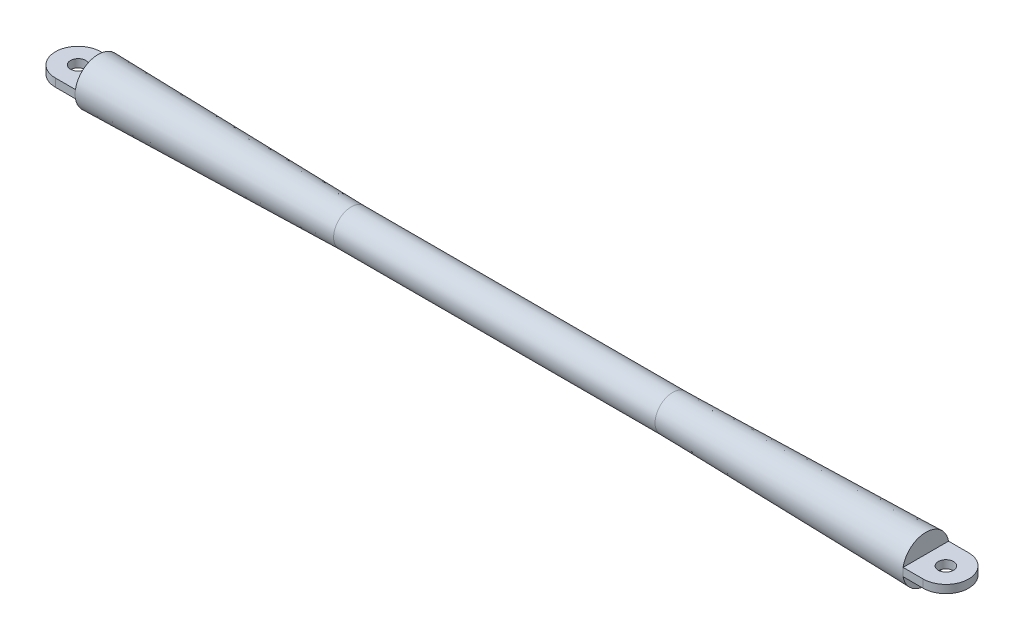
ISO-10303-21;
HEADER;
FILE_DESCRIPTION(('STEP AP214'),'2;1');
FILE_NAME('part.step','',(''),(''),'','','');
FILE_SCHEMA(('AUTOMOTIVE_DESIGN { 1 0 10303 214 1 1 1 1 }'));
ENDSEC;
DATA;
#1=APPLICATION_CONTEXT('core data for automotive mechanical design processes');
#2=APPLICATION_PROTOCOL_DEFINITION('international standard','automotive_design',2000,#1);
#3=PRODUCT_CONTEXT('',#1,'mechanical');
#4=PRODUCT('Part','Part','',(#3));
#5=PRODUCT_RELATED_PRODUCT_CATEGORY('part','',(#4));
#6=PRODUCT_DEFINITION_FORMATION('','',#4);
#7=PRODUCT_DEFINITION_CONTEXT('part definition',#1,'design');
#8=PRODUCT_DEFINITION('design','',#6,#7);
#9=PRODUCT_DEFINITION_SHAPE('','',#8);
#10=(LENGTH_UNIT() NAMED_UNIT(*) SI_UNIT(.MILLI.,.METRE.));
#11=(NAMED_UNIT(*) PLANE_ANGLE_UNIT() SI_UNIT($,.RADIAN.));
#12=(NAMED_UNIT(*) SI_UNIT($,.STERADIAN.) SOLID_ANGLE_UNIT());
#13=UNCERTAINTY_MEASURE_WITH_UNIT(LENGTH_MEASURE(1.E-05),#10,'distance_accuracy_value','');
#14=(GEOMETRIC_REPRESENTATION_CONTEXT(3) GLOBAL_UNCERTAINTY_ASSIGNED_CONTEXT((#13)) GLOBAL_UNIT_ASSIGNED_CONTEXT((#10,
#11,#12)) REPRESENTATION_CONTEXT('',''));
#15=CARTESIAN_POINT('',(0.,0.,0.));
#16=DIRECTION('',(0.,0.,1.));
#17=DIRECTION('',(1.,0.,0.));
#18=AXIS2_PLACEMENT_3D('',#15,#16,#17);
#19=CARTESIAN_POINT('',(575.,0.,0.));
#20=DIRECTION('',(1.,0.,0.));
#21=DIRECTION('',(0.,0.,-1.));
#22=AXIS2_PLACEMENT_3D('',#19,#20,#21);
#23=CONICAL_SURFACE('',#22,30.,0.0213300978711052);
#24=CARTESIAN_POINT('',(200.,0.,0.));
#25=DIRECTION('',(-1.,0.,0.));
#26=DIRECTION('',(0.,0.,1.));
#27=AXIS2_PLACEMENT_3D('',#24,#25,#26);
#28=CIRCLE('',#27,22.);
#29=CARTESIAN_POINT('',(200.,0.,22.));
#30=VERTEX_POINT('',#29);
#31=EDGE_CURVE('E189',#30,#30,#28,.T.);
#32=ORIENTED_EDGE('',*,*,#31,.F.);
#33=EDGE_LOOP('',(#32));
#34=FACE_BOUND('',#33,.T.);
#35=CARTESIAN_POINT('',(515.,0.,0.));
#36=DIRECTION('',(-1.,0.,0.));
#37=DIRECTION('',(0.,0.,1.));
#38=AXIS2_PLACEMENT_3D('',#35,#36,#37);
#39=CIRCLE('',#38,28.72);
#40=CARTESIAN_POINT('',(515.,5.,28.2814143917874));
#41=VERTEX_POINT('',#40);
#42=CARTESIAN_POINT('',(515.,5.,-28.2814143917874));
#43=VERTEX_POINT('',#42);
#44=EDGE_CURVE('E197',#41,#43,#39,.T.);
#45=ORIENTED_EDGE('',*,*,#44,.T.);
#46=CARTESIAN_POINT('',(515.,0.,0.));
#47=DIRECTION('',(-1.,0.,0.));
#48=DIRECTION('',(0.,-1.,0.));
#49=AXIS2_PLACEMENT_3D('',#46,#47,#48);
#50=CIRCLE('',#49,28.72);
#51=CARTESIAN_POINT('',(515.,-5.,-28.2814143917874));
#52=VERTEX_POINT('',#51);
#53=EDGE_CURVE('E182',#43,#52,#50,.T.);
#54=ORIENTED_EDGE('',*,*,#53,.T.);
#55=CARTESIAN_POINT('',(515.,0.,0.));
#56=DIRECTION('',(-1.,0.,0.));
#57=DIRECTION('',(0.,0.,1.));
#58=AXIS2_PLACEMENT_3D('',#55,#56,#57);
#59=CIRCLE('',#58,28.72);
#60=CARTESIAN_POINT('',(515.,-5.,28.2814143917874));
#61=VERTEX_POINT('',#60);
#62=EDGE_CURVE('E194',#52,#61,#59,.T.);
#63=ORIENTED_EDGE('',*,*,#62,.T.);
#64=CARTESIAN_POINT('',(515.,0.,0.));
#65=DIRECTION('',(-1.,0.,0.));
#66=DIRECTION('',(0.,-1.,0.));
#67=AXIS2_PLACEMENT_3D('',#64,#65,#66);
#68=CIRCLE('',#67,28.72);
#69=EDGE_CURVE('E179',#61,#41,#68,.T.);
#70=ORIENTED_EDGE('',*,*,#69,.T.);
#71=EDGE_LOOP('',(#45,#54,#63,#70));
#72=FACE_BOUND('',#71,.T.);
#73=ADVANCED_FACE('F37',(#34,#72),#23,.T.);
#74=CARTESIAN_POINT('',(0.,0.,0.));
#75=DIRECTION('',(-1.,0.,0.));
#76=DIRECTION('',(0.,0.,1.));
#77=AXIS2_PLACEMENT_3D('',#74,#75,#76);
#78=CYLINDRICAL_SURFACE('',#77,22.);
#79=ORIENTED_EDGE('',*,*,#31,.T.);
#80=EDGE_LOOP('',(#79));
#81=FACE_BOUND('',#80,.T.);
#82=CARTESIAN_POINT('',(-200.,0.,0.));
#83=DIRECTION('',(-1.,0.,0.));
#84=DIRECTION('',(0.,0.,1.));
#85=AXIS2_PLACEMENT_3D('',#82,#83,#84);
#86=CIRCLE('',#85,22.);
#87=CARTESIAN_POINT('',(-200.,0.,22.));
#88=VERTEX_POINT('',#87);
#89=EDGE_CURVE('E143',#88,#88,#86,.T.);
#90=ORIENTED_EDGE('',*,*,#89,.F.);
#91=EDGE_LOOP('',(#90));
#92=FACE_BOUND('',#91,.T.);
#93=ADVANCED_FACE('F235',(#81,#92),#78,.T.);
#94=CARTESIAN_POINT('',(515.,-74.756116377523,-50.));
#95=DIRECTION('',(-1.,0.,0.));
#96=DIRECTION('',(0.,0.,1.));
#97=AXIS2_PLACEMENT_3D('',#94,#95,#96);
#98=PLANE('',#97);
#99=DIRECTION('',(0.,0.,1.));
#100=VECTOR('',#99,1.);
#101=CARTESIAN_POINT('',(515.,-5.,-50.));
#102=LINE('',#101,#100);
#103=EDGE_CURVE('E185',#52,#61,#102,.T.);
#104=ORIENTED_EDGE('',*,*,#103,.T.);
#105=ORIENTED_EDGE('',*,*,#62,.F.);
#106=EDGE_LOOP('',(#104,#105));
#107=FACE_BOUND('',#106,.T.);
#108=ADVANCED_FACE('F216',(#107),#98,.F.);
#109=CARTESIAN_POINT('',(515.,-5.,-50.));
#110=DIRECTION('',(0.,1.,0.));
#111=DIRECTION('',(-1.,0.,0.));
#112=AXIS2_PLACEMENT_3D('',#109,#110,#111);
#113=PLANE('',#112);
#114=CARTESIAN_POINT('',(540.,-5.,0.));
#115=DIRECTION('',(0.,1.,0.));
#116=DIRECTION('',(-1.,0.,0.));
#117=AXIS2_PLACEMENT_3D('',#114,#115,#116);
#118=CIRCLE('',#117,9.49999999999995);
#119=CARTESIAN_POINT('',(530.5,-5.,0.));
#120=VERTEX_POINT('',#119);
#121=EDGE_CURVE('E159',#120,#120,#118,.T.);
#122=ORIENTED_EDGE('',*,*,#121,.T.);
#123=EDGE_LOOP('',(#122));
#124=FACE_BOUND('',#123,.T.);
#125=CARTESIAN_POINT('',(540.,-5.,0.));
#126=DIRECTION('',(0.,1.,0.));
#127=DIRECTION('',(-1.,0.,0.));
#128=AXIS2_PLACEMENT_3D('',#125,#126,#127);
#129=CIRCLE('',#128,28.2814143917874);
#130=CARTESIAN_POINT('',(540.,-5.,-28.2814143917874));
#131=VERTEX_POINT('',#130);
#132=CARTESIAN_POINT('',(540.,-5.,28.2814143917874));
#133=VERTEX_POINT('',#132);
#134=EDGE_CURVE('E173',#131,#133,#129,.F.);
#135=ORIENTED_EDGE('',*,*,#134,.T.);
#136=DIRECTION('',(-1.,0.,0.));
#137=VECTOR('',#136,1.);
#138=CARTESIAN_POINT('',(515.,-5.,28.2814143917874));
#139=LINE('',#138,#137);
#140=EDGE_CURVE('E176',#133,#61,#139,.T.);
#141=ORIENTED_EDGE('',*,*,#140,.T.);
#142=ORIENTED_EDGE('',*,*,#103,.F.);
#143=DIRECTION('',(1.,0.,0.));
#144=VECTOR('',#143,1.);
#145=CARTESIAN_POINT('',(515.,-5.,-28.2814143917874));
#146=LINE('',#145,#144);
#147=EDGE_CURVE('E164',#52,#131,#146,.T.);
#148=ORIENTED_EDGE('',*,*,#147,.T.);
#149=EDGE_LOOP('',(#135,#141,#142,#148));
#150=FACE_BOUND('',#149,.T.);
#151=ADVANCED_FACE('F213',(#124,#150),#113,.F.);
#152=CARTESIAN_POINT('',(515.,74.756116377523,-50.));
#153=DIRECTION('',(-1.,0.,0.));
#154=DIRECTION('',(0.,0.,1.));
#155=AXIS2_PLACEMENT_3D('',#152,#153,#154);
#156=PLANE('',#155);
#157=DIRECTION('',(0.,0.,1.));
#158=VECTOR('',#157,1.);
#159=CARTESIAN_POINT('',(515.,5.,-50.));
#160=LINE('',#159,#158);
#161=EDGE_CURVE('E186',#43,#41,#160,.T.);
#162=ORIENTED_EDGE('',*,*,#161,.F.);
#163=ORIENTED_EDGE('',*,*,#44,.F.);
#164=EDGE_LOOP('',(#162,#163));
#165=FACE_BOUND('',#164,.T.);
#166=ADVANCED_FACE('F230',(#165),#156,.F.);
#167=CARTESIAN_POINT('',(515.,5.,-50.));
#168=DIRECTION('',(0.,-1.,0.));
#169=DIRECTION('',(1.,0.,0.));
#170=AXIS2_PLACEMENT_3D('',#167,#168,#169);
#171=PLANE('',#170);
#172=CARTESIAN_POINT('',(540.,5.,0.));
#173=DIRECTION('',(0.,1.,0.));
#174=DIRECTION('',(-1.,0.,0.));
#175=AXIS2_PLACEMENT_3D('',#172,#173,#174);
#176=CIRCLE('',#175,9.49999999999995);
#177=CARTESIAN_POINT('',(530.5,5.,0.));
#178=VERTEX_POINT('',#177);
#179=EDGE_CURVE('E156',#178,#178,#176,.T.);
#180=ORIENTED_EDGE('',*,*,#179,.F.);
#181=EDGE_LOOP('',(#180));
#182=FACE_BOUND('',#181,.T.);
#183=ORIENTED_EDGE('',*,*,#161,.T.);
#184=DIRECTION('',(1.,0.,0.));
#185=VECTOR('',#184,1.);
#186=CARTESIAN_POINT('',(515.,5.,28.2814143917874));
#187=LINE('',#186,#185);
#188=CARTESIAN_POINT('',(540.,5.,28.2814143917874));
#189=VERTEX_POINT('',#188);
#190=EDGE_CURVE('E11',#41,#189,#187,.T.);
#191=ORIENTED_EDGE('',*,*,#190,.T.);
#192=CARTESIAN_POINT('',(540.,5.,0.));
#193=DIRECTION('',(0.,-1.,0.));
#194=DIRECTION('',(1.,0.,0.));
#195=AXIS2_PLACEMENT_3D('',#192,#193,#194);
#196=CIRCLE('',#195,28.2814143917874);
#197=CARTESIAN_POINT('',(540.,5.,-28.2814143917874));
#198=VERTEX_POINT('',#197);
#199=EDGE_CURVE('E44',#189,#198,#196,.F.);
#200=ORIENTED_EDGE('',*,*,#199,.T.);
#201=DIRECTION('',(-1.,0.,0.));
#202=VECTOR('',#201,1.);
#203=CARTESIAN_POINT('',(515.,5.,-28.2814143917874));
#204=LINE('',#203,#202);
#205=EDGE_CURVE('E200',#198,#43,#204,.T.);
#206=ORIENTED_EDGE('',*,*,#205,.T.);
#207=EDGE_LOOP('',(#183,#191,#200,#206));
#208=FACE_BOUND('',#207,.T.);
#209=ADVANCED_FACE('F204',(#182,#208),#171,.F.);
#210=CARTESIAN_POINT('',(515.,-45.,-28.2814143917874));
#211=DIRECTION('',(-1.,0.,0.));
#212=DIRECTION('',(0.,-1.,0.));
#213=AXIS2_PLACEMENT_3D('',#210,#211,#212);
#214=PLANE('',#213);
#215=DIRECTION('',(0.,1.,0.));
#216=VECTOR('',#215,1.);
#217=CARTESIAN_POINT('',(515.,-45.,-28.2814143917874));
#218=LINE('',#217,#216);
#219=EDGE_CURVE('E51',#52,#43,#218,.T.);
#220=ORIENTED_EDGE('',*,*,#219,.F.);
#221=ORIENTED_EDGE('',*,*,#53,.F.);
#222=EDGE_LOOP('',(#220,#221));
#223=FACE_BOUND('',#222,.T.);
#224=ADVANCED_FACE('F220',(#223),#214,.F.);
#225=CARTESIAN_POINT('',(515.,-45.,51.2094652281084));
#226=DIRECTION('',(-1.,0.,0.));
#227=DIRECTION('',(0.,-1.,0.));
#228=AXIS2_PLACEMENT_3D('',#225,#226,#227);
#229=PLANE('',#228);
#230=DIRECTION('',(0.,1.,0.));
#231=VECTOR('',#230,1.);
#232=CARTESIAN_POINT('',(515.,-45.,28.2814143917874));
#233=LINE('',#232,#231);
#234=EDGE_CURVE('E162',#61,#41,#233,.T.);
#235=ORIENTED_EDGE('',*,*,#234,.T.);
#236=ORIENTED_EDGE('',*,*,#69,.F.);
#237=EDGE_LOOP('',(#235,#236));
#238=FACE_BOUND('',#237,.T.);
#239=ADVANCED_FACE('F222',(#238),#229,.F.);
#240=CARTESIAN_POINT('',(515.,-45.,28.2814143917874));
#241=DIRECTION('',(0.,0.,-1.));
#242=DIRECTION('',(-1.,0.,0.));
#243=AXIS2_PLACEMENT_3D('',#240,#241,#242);
#244=PLANE('',#243);
#245=DIRECTION('',(0.,1.,0.));
#246=VECTOR('',#245,1.);
#247=CARTESIAN_POINT('',(540.,-45.,28.2814143917874));
#248=LINE('',#247,#246);
#249=EDGE_CURVE('E165',#133,#189,#248,.T.);
#250=ORIENTED_EDGE('',*,*,#249,.T.);
#251=ORIENTED_EDGE('',*,*,#190,.F.);
#252=ORIENTED_EDGE('',*,*,#234,.F.);
#253=ORIENTED_EDGE('',*,*,#140,.F.);
#254=EDGE_LOOP('',(#250,#251,#252,#253));
#255=FACE_BOUND('',#254,.T.);
#256=ADVANCED_FACE('F210',(#255),#244,.F.);
#257=CARTESIAN_POINT('',(540.,-45.,0.));
#258=DIRECTION('',(0.,1.,0.));
#259=DIRECTION('',(-1.,0.,0.));
#260=AXIS2_PLACEMENT_3D('',#257,#258,#259);
#261=CYLINDRICAL_SURFACE('',#260,28.2814143917874);
#262=DIRECTION('',(0.,1.,0.));
#263=VECTOR('',#262,1.);
#264=CARTESIAN_POINT('',(540.,-45.,-28.2814143917874));
#265=LINE('',#264,#263);
#266=EDGE_CURVE('E167',#131,#198,#265,.T.);
#267=ORIENTED_EDGE('',*,*,#266,.T.);
#268=ORIENTED_EDGE('',*,*,#199,.F.);
#269=ORIENTED_EDGE('',*,*,#249,.F.);
#270=ORIENTED_EDGE('',*,*,#134,.F.);
#271=EDGE_LOOP('',(#267,#268,#269,#270));
#272=FACE_BOUND('',#271,.T.);
#273=ADVANCED_FACE('F208',(#272),#261,.T.);
#274=CARTESIAN_POINT('',(515.,-45.,-28.2814143917874));
#275=DIRECTION('',(0.,0.,1.));
#276=DIRECTION('',(1.,0.,0.));
#277=AXIS2_PLACEMENT_3D('',#274,#275,#276);
#278=PLANE('',#277);
#279=ORIENTED_EDGE('',*,*,#219,.T.);
#280=ORIENTED_EDGE('',*,*,#205,.F.);
#281=ORIENTED_EDGE('',*,*,#266,.F.);
#282=ORIENTED_EDGE('',*,*,#147,.F.);
#283=EDGE_LOOP('',(#279,#280,#281,#282));
#284=FACE_BOUND('',#283,.T.);
#285=ADVANCED_FACE('F253',(#284),#278,.F.);
#286=CARTESIAN_POINT('',(540.,-28.72,0.));
#287=DIRECTION('',(0.,1.,0.));
#288=DIRECTION('',(-1.,0.,0.));
#289=AXIS2_PLACEMENT_3D('',#286,#287,#288);
#290=CYLINDRICAL_SURFACE('',#289,9.49999999999995);
#291=ORIENTED_EDGE('',*,*,#179,.T.);
#292=EDGE_LOOP('',(#291));
#293=FACE_BOUND('',#292,.T.);
#294=ORIENTED_EDGE('',*,*,#121,.F.);
#295=EDGE_LOOP('',(#294));
#296=FACE_BOUND('',#295,.T.);
#297=ADVANCED_FACE('F246',(#293,#296),#290,.F.);
#298=CARTESIAN_POINT('',(-575.,0.,0.));
#299=DIRECTION('',(-1.,0.,0.));
#300=DIRECTION('',(0.,0.,-1.));
#301=AXIS2_PLACEMENT_3D('',#298,#299,#300);
#302=CONICAL_SURFACE('',#301,30.,0.0213300978711052);
#303=ORIENTED_EDGE('',*,*,#89,.T.);
#304=EDGE_LOOP('',(#303));
#305=FACE_BOUND('',#304,.T.);
#306=CARTESIAN_POINT('',(-515.,0.,0.));
#307=DIRECTION('',(-1.,0.,0.));
#308=DIRECTION('',(0.,0.,1.));
#309=AXIS2_PLACEMENT_3D('',#306,#307,#308);
#310=CIRCLE('',#309,28.72);
#311=CARTESIAN_POINT('',(-515.,5.,28.2814143917874));
#312=VERTEX_POINT('',#311);
#313=CARTESIAN_POINT('',(-515.,5.,-28.2814143917874));
#314=VERTEX_POINT('',#313);
#315=EDGE_CURVE('E142',#312,#314,#310,.T.);
#316=ORIENTED_EDGE('',*,*,#315,.F.);
#317=CARTESIAN_POINT('',(-515.,0.,0.));
#318=DIRECTION('',(-1.,0.,0.));
#319=DIRECTION('',(0.,-1.,0.));
#320=AXIS2_PLACEMENT_3D('',#317,#318,#319);
#321=CIRCLE('',#320,28.72);
#322=CARTESIAN_POINT('',(-515.,-5.,28.2814143917874));
#323=VERTEX_POINT('',#322);
#324=EDGE_CURVE('E138',#323,#312,#321,.T.);
#325=ORIENTED_EDGE('',*,*,#324,.F.);
#326=CARTESIAN_POINT('',(-515.,0.,0.));
#327=DIRECTION('',(-1.,0.,0.));
#328=DIRECTION('',(0.,0.,1.));
#329=AXIS2_PLACEMENT_3D('',#326,#327,#328);
#330=CIRCLE('',#329,28.72);
#331=CARTESIAN_POINT('',(-515.,-5.,-28.2814143917874));
#332=VERTEX_POINT('',#331);
#333=EDGE_CURVE('E128',#332,#323,#330,.T.);
#334=ORIENTED_EDGE('',*,*,#333,.F.);
#335=CARTESIAN_POINT('',(-515.,0.,0.));
#336=DIRECTION('',(-1.,0.,0.));
#337=DIRECTION('',(0.,-1.,0.));
#338=AXIS2_PLACEMENT_3D('',#335,#336,#337);
#339=CIRCLE('',#338,28.72);
#340=EDGE_CURVE('E131',#314,#332,#339,.T.);
#341=ORIENTED_EDGE('',*,*,#340,.F.);
#342=EDGE_LOOP('',(#316,#325,#334,#341));
#343=FACE_BOUND('',#342,.T.);
#344=ADVANCED_FACE('F140',(#305,#343),#302,.T.);
#345=CARTESIAN_POINT('',(-515.,-74.756116377523,-50.));
#346=DIRECTION('',(1.,0.,0.));
#347=DIRECTION('',(0.,0.,1.));
#348=AXIS2_PLACEMENT_3D('',#345,#346,#347);
#349=PLANE('',#348);
#350=DIRECTION('',(0.,0.,1.));
#351=VECTOR('',#350,1.);
#352=CARTESIAN_POINT('',(-515.,-5.,-50.));
#353=LINE('',#352,#351);
#354=EDGE_CURVE('E119',#332,#323,#353,.T.);
#355=ORIENTED_EDGE('',*,*,#354,.F.);
#356=ORIENTED_EDGE('',*,*,#333,.T.);
#357=EDGE_LOOP('',(#355,#356));
#358=FACE_BOUND('',#357,.T.);
#359=ADVANCED_FACE('F126',(#358),#349,.F.);
#360=CARTESIAN_POINT('',(-515.,-5.,-50.));
#361=DIRECTION('',(0.,1.,0.));
#362=DIRECTION('',(1.,0.,0.));
#363=AXIS2_PLACEMENT_3D('',#360,#361,#362);
#364=PLANE('',#363);
#365=CARTESIAN_POINT('',(-540.,-5.,0.));
#366=DIRECTION('',(0.,-1.,0.));
#367=DIRECTION('',(1.,0.,0.));
#368=AXIS2_PLACEMENT_3D('',#365,#366,#367);
#369=CIRCLE('',#368,9.49999999999995);
#370=CARTESIAN_POINT('',(-530.5,-5.,0.));
#371=VERTEX_POINT('',#370);
#372=EDGE_CURVE('E112',#371,#371,#369,.T.);
#373=ORIENTED_EDGE('',*,*,#372,.F.);
#374=EDGE_LOOP('',(#373));
#375=FACE_BOUND('',#374,.T.);
#376=CARTESIAN_POINT('',(-540.,-5.,0.));
#377=DIRECTION('',(0.,-1.,0.));
#378=DIRECTION('',(1.,0.,0.));
#379=AXIS2_PLACEMENT_3D('',#376,#377,#378);
#380=CIRCLE('',#379,28.2814143917874);
#381=CARTESIAN_POINT('',(-540.,-5.,-28.2814143917874));
#382=VERTEX_POINT('',#381);
#383=CARTESIAN_POINT('',(-540.,-5.,28.2814143917874));
#384=VERTEX_POINT('',#383);
#385=EDGE_CURVE('E122',#382,#384,#380,.F.);
#386=ORIENTED_EDGE('',*,*,#385,.F.);
#387=DIRECTION('',(-1.,0.,0.));
#388=VECTOR('',#387,1.);
#389=CARTESIAN_POINT('',(-515.,-5.,-28.2814143917874));
#390=LINE('',#389,#388);
#391=EDGE_CURVE('E104',#332,#382,#390,.T.);
#392=ORIENTED_EDGE('',*,*,#391,.F.);
#393=ORIENTED_EDGE('',*,*,#354,.T.);
#394=DIRECTION('',(1.,0.,0.));
#395=VECTOR('',#394,1.);
#396=CARTESIAN_POINT('',(-515.,-5.,28.2814143917874));
#397=LINE('',#396,#395);
#398=EDGE_CURVE('E495',#384,#323,#397,.T.);
#399=ORIENTED_EDGE('',*,*,#398,.F.);
#400=EDGE_LOOP('',(#386,#392,#393,#399));
#401=FACE_BOUND('',#400,.T.);
#402=ADVANCED_FACE('F117',(#375,#401),#364,.F.);
#403=CARTESIAN_POINT('',(-515.,74.756116377523,-50.));
#404=DIRECTION('',(1.,0.,0.));
#405=DIRECTION('',(0.,0.,1.));
#406=AXIS2_PLACEMENT_3D('',#403,#404,#405);
#407=PLANE('',#406);
#408=DIRECTION('',(0.,0.,1.));
#409=VECTOR('',#408,1.);
#410=CARTESIAN_POINT('',(-515.,5.,-50.));
#411=LINE('',#410,#409);
#412=EDGE_CURVE('E130',#314,#312,#411,.T.);
#413=ORIENTED_EDGE('',*,*,#412,.T.);
#414=ORIENTED_EDGE('',*,*,#315,.T.);
#415=EDGE_LOOP('',(#413,#414));
#416=FACE_BOUND('',#415,.T.);
#417=ADVANCED_FACE('F376',(#416),#407,.F.);
#418=CARTESIAN_POINT('',(-515.,5.,-50.));
#419=DIRECTION('',(0.,-1.,0.));
#420=DIRECTION('',(-1.,0.,0.));
#421=AXIS2_PLACEMENT_3D('',#418,#419,#420);
#422=PLANE('',#421);
#423=CARTESIAN_POINT('',(-540.,5.,0.));
#424=DIRECTION('',(0.,-1.,0.));
#425=DIRECTION('',(1.,0.,0.));
#426=AXIS2_PLACEMENT_3D('',#423,#424,#425);
#427=CIRCLE('',#426,9.49999999999995);
#428=CARTESIAN_POINT('',(-530.5,5.,0.));
#429=VERTEX_POINT('',#428);
#430=EDGE_CURVE('E484',#429,#429,#427,.T.);
#431=ORIENTED_EDGE('',*,*,#430,.T.);
#432=EDGE_LOOP('',(#431));
#433=FACE_BOUND('',#432,.T.);
#434=ORIENTED_EDGE('',*,*,#412,.F.);
#435=DIRECTION('',(1.,0.,0.));
#436=VECTOR('',#435,1.);
#437=CARTESIAN_POINT('',(-515.,5.,-28.2814143917874));
#438=LINE('',#437,#436);
#439=CARTESIAN_POINT('',(-540.,5.,-28.2814143917874));
#440=VERTEX_POINT('',#439);
#441=EDGE_CURVE('E107',#440,#314,#438,.T.);
#442=ORIENTED_EDGE('',*,*,#441,.F.);
#443=CARTESIAN_POINT('',(-540.,5.,0.));
#444=DIRECTION('',(0.,1.,0.));
#445=DIRECTION('',(-1.,0.,0.));
#446=AXIS2_PLACEMENT_3D('',#443,#444,#445);
#447=CIRCLE('',#446,28.2814143917874);
#448=CARTESIAN_POINT('',(-540.,5.,28.2814143917874));
#449=VERTEX_POINT('',#448);
#450=EDGE_CURVE('E150',#449,#440,#447,.F.);
#451=ORIENTED_EDGE('',*,*,#450,.F.);
#452=DIRECTION('',(-1.,0.,0.));
#453=VECTOR('',#452,1.);
#454=CARTESIAN_POINT('',(-515.,5.,28.2814143917874));
#455=LINE('',#454,#453);
#456=EDGE_CURVE('E153',#312,#449,#455,.T.);
#457=ORIENTED_EDGE('',*,*,#456,.F.);
#458=EDGE_LOOP('',(#434,#442,#451,#457));
#459=FACE_BOUND('',#458,.T.);
#460=ADVANCED_FACE('F386',(#433,#459),#422,.F.);
#461=CARTESIAN_POINT('',(-515.,-45.,-28.2814143917874));
#462=DIRECTION('',(1.,0.,0.));
#463=DIRECTION('',(0.,-1.,0.));
#464=AXIS2_PLACEMENT_3D('',#461,#462,#463);
#465=PLANE('',#464);
#466=DIRECTION('',(0.,1.,0.));
#467=VECTOR('',#466,1.);
#468=CARTESIAN_POINT('',(-515.,-45.,-28.2814143917874));
#469=LINE('',#468,#467);
#470=EDGE_CURVE('E101',#332,#314,#469,.T.);
#471=ORIENTED_EDGE('',*,*,#470,.T.);
#472=ORIENTED_EDGE('',*,*,#340,.T.);
#473=EDGE_LOOP('',(#471,#472));
#474=FACE_BOUND('',#473,.T.);
#475=ADVANCED_FACE('F134',(#474),#465,.F.);
#476=CARTESIAN_POINT('',(-515.,-45.,51.2094652281084));
#477=DIRECTION('',(1.,0.,0.));
#478=DIRECTION('',(0.,-1.,0.));
#479=AXIS2_PLACEMENT_3D('',#476,#477,#478);
#480=PLANE('',#479);
#481=DIRECTION('',(0.,1.,0.));
#482=VECTOR('',#481,1.);
#483=CARTESIAN_POINT('',(-515.,-45.,28.2814143917874));
#484=LINE('',#483,#482);
#485=EDGE_CURVE('E123',#323,#312,#484,.T.);
#486=ORIENTED_EDGE('',*,*,#485,.F.);
#487=ORIENTED_EDGE('',*,*,#324,.T.);
#488=EDGE_LOOP('',(#486,#487));
#489=FACE_BOUND('',#488,.T.);
#490=ADVANCED_FACE('F407',(#489),#480,.F.);
#491=CARTESIAN_POINT('',(-515.,-45.,28.2814143917874));
#492=DIRECTION('',(0.,0.,-1.));
#493=DIRECTION('',(1.,0.,0.));
#494=AXIS2_PLACEMENT_3D('',#491,#492,#493);
#495=PLANE('',#494);
#496=DIRECTION('',(0.,1.,0.));
#497=VECTOR('',#496,1.);
#498=CARTESIAN_POINT('',(-540.,-45.,28.2814143917874));
#499=LINE('',#498,#497);
#500=EDGE_CURVE('E491',#384,#449,#499,.T.);
#501=ORIENTED_EDGE('',*,*,#500,.F.);
#502=ORIENTED_EDGE('',*,*,#398,.T.);
#503=ORIENTED_EDGE('',*,*,#485,.T.);
#504=ORIENTED_EDGE('',*,*,#456,.T.);
#505=EDGE_LOOP('',(#501,#502,#503,#504));
#506=FACE_BOUND('',#505,.T.);
#507=ADVANCED_FACE('F417',(#506),#495,.F.);
#508=CARTESIAN_POINT('',(-540.,-45.,0.));
#509=DIRECTION('',(0.,1.,0.));
#510=DIRECTION('',(1.,0.,0.));
#511=AXIS2_PLACEMENT_3D('',#508,#509,#510);
#512=CYLINDRICAL_SURFACE('',#511,28.2814143917874);
#513=DIRECTION('',(0.,1.,0.));
#514=VECTOR('',#513,1.);
#515=CARTESIAN_POINT('',(-540.,-45.,-28.2814143917874));
#516=LINE('',#515,#514);
#517=EDGE_CURVE('E111',#382,#440,#516,.T.);
#518=ORIENTED_EDGE('',*,*,#517,.F.);
#519=ORIENTED_EDGE('',*,*,#385,.T.);
#520=ORIENTED_EDGE('',*,*,#500,.T.);
#521=ORIENTED_EDGE('',*,*,#450,.T.);
#522=EDGE_LOOP('',(#518,#519,#520,#521));
#523=FACE_BOUND('',#522,.T.);
#524=ADVANCED_FACE('F428',(#523),#512,.T.);
#525=CARTESIAN_POINT('',(-515.,-45.,-28.2814143917874));
#526=DIRECTION('',(0.,0.,1.));
#527=DIRECTION('',(-1.,0.,0.));
#528=AXIS2_PLACEMENT_3D('',#525,#526,#527);
#529=PLANE('',#528);
#530=ORIENTED_EDGE('',*,*,#470,.F.);
#531=ORIENTED_EDGE('',*,*,#391,.T.);
#532=ORIENTED_EDGE('',*,*,#517,.T.);
#533=ORIENTED_EDGE('',*,*,#441,.T.);
#534=EDGE_LOOP('',(#530,#531,#532,#533));
#535=FACE_BOUND('',#534,.T.);
#536=ADVANCED_FACE('F103',(#535),#529,.F.);
#537=CARTESIAN_POINT('',(-540.,-28.72,0.));
#538=DIRECTION('',(0.,1.,0.));
#539=DIRECTION('',(1.,0.,0.));
#540=AXIS2_PLACEMENT_3D('',#537,#538,#539);
#541=CYLINDRICAL_SURFACE('',#540,9.49999999999995);
#542=ORIENTED_EDGE('',*,*,#430,.F.);
#543=EDGE_LOOP('',(#542));
#544=FACE_BOUND('',#543,.T.);
#545=ORIENTED_EDGE('',*,*,#372,.T.);
#546=EDGE_LOOP('',(#545));
#547=FACE_BOUND('',#546,.T.);
#548=ADVANCED_FACE('F449',(#544,#547),#541,.F.);
#549=CLOSED_SHELL('',(#73,#93,#108,#151,#166,#209,#224,#239,#256,#273,#285,#297,#344,#359,#402,
#417,#460,#475,#490,#507,#524,#536,#548));
#550=MANIFOLD_SOLID_BREP('B2',#549);
#551=ADVANCED_BREP_SHAPE_REPRESENTATION('',(#18,#550),#14);
#552=SHAPE_DEFINITION_REPRESENTATION(#9,#551);
ENDSEC;
END-ISO-10303-21;
